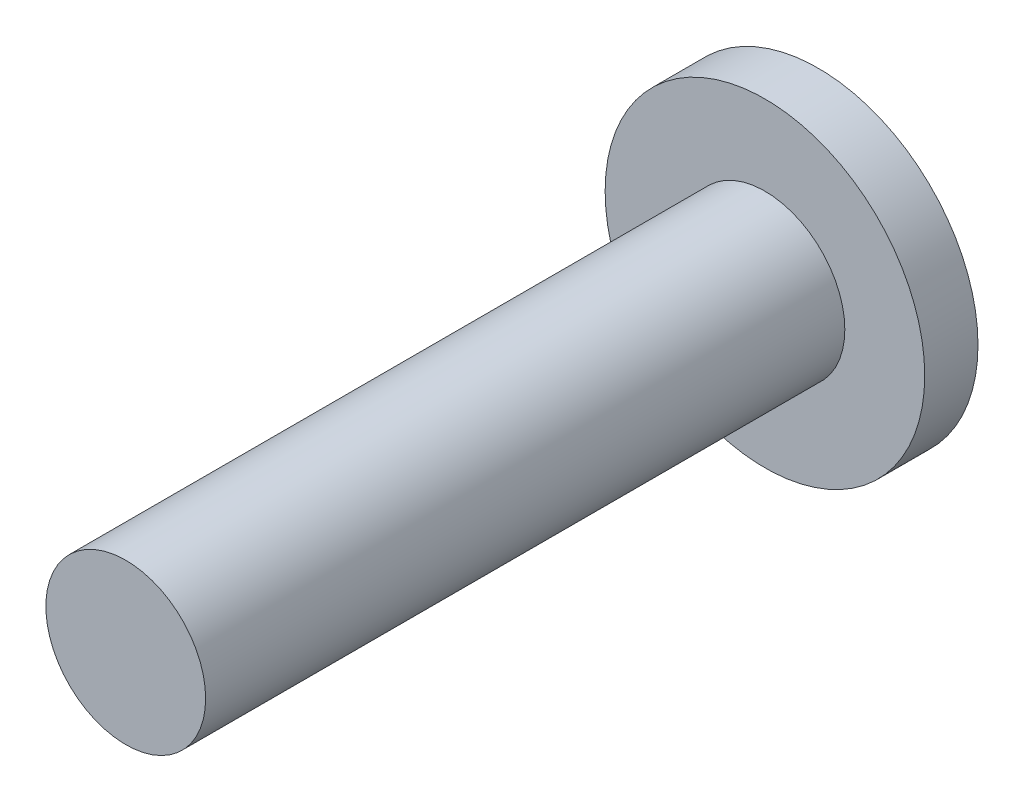
ISO-10303-21;
HEADER;
FILE_DESCRIPTION(('STEP AP214'),'2;1');
FILE_NAME('part.step','',(''),(''),'','','');
FILE_SCHEMA(('AUTOMOTIVE_DESIGN { 1 0 10303 214 1 1 1 1 }'));
ENDSEC;
DATA;
#1=APPLICATION_CONTEXT('core data for automotive mechanical design processes');
#2=APPLICATION_PROTOCOL_DEFINITION('international standard','automotive_design',2000,#1);
#3=PRODUCT_CONTEXT('',#1,'mechanical');
#4=PRODUCT('Part','Part','',(#3));
#5=PRODUCT_RELATED_PRODUCT_CATEGORY('part','',(#4));
#6=PRODUCT_DEFINITION_FORMATION('','',#4);
#7=PRODUCT_DEFINITION_CONTEXT('part definition',#1,'design');
#8=PRODUCT_DEFINITION('design','',#6,#7);
#9=PRODUCT_DEFINITION_SHAPE('','',#8);
#10=(LENGTH_UNIT() NAMED_UNIT(*) SI_UNIT(.MILLI.,.METRE.));
#11=(NAMED_UNIT(*) PLANE_ANGLE_UNIT() SI_UNIT($,.RADIAN.));
#12=(NAMED_UNIT(*) SI_UNIT($,.STERADIAN.) SOLID_ANGLE_UNIT());
#13=UNCERTAINTY_MEASURE_WITH_UNIT(LENGTH_MEASURE(1.E-05),#10,'distance_accuracy_value','');
#14=(GEOMETRIC_REPRESENTATION_CONTEXT(3) GLOBAL_UNCERTAINTY_ASSIGNED_CONTEXT((#13)) GLOBAL_UNIT_ASSIGNED_CONTEXT((#10,
#11,#12)) REPRESENTATION_CONTEXT('',''));
#15=CARTESIAN_POINT('',(0.,0.,0.));
#16=DIRECTION('',(0.,0.,1.));
#17=DIRECTION('',(1.,0.,0.));
#18=AXIS2_PLACEMENT_3D('',#15,#16,#17);
#19=CARTESIAN_POINT('',(0.,0.,1.));
#20=DIRECTION('',(0.,0.,-1.));
#21=DIRECTION('',(-1.,0.,0.));
#22=AXIS2_PLACEMENT_3D('',#19,#20,#21);
#23=CYLINDRICAL_SURFACE('',#22,3.);
#24=CARTESIAN_POINT('',(0.,0.,1.));
#25=DIRECTION('',(0.,0.,1.));
#26=DIRECTION('',(1.,0.,0.));
#27=AXIS2_PLACEMENT_3D('',#24,#25,#26);
#28=CIRCLE('',#27,3.);
#29=CARTESIAN_POINT('',(3.,0.,1.));
#30=VERTEX_POINT('',#29);
#31=EDGE_CURVE('E11',#30,#30,#28,.T.);
#32=ORIENTED_EDGE('',*,*,#31,.F.);
#33=EDGE_LOOP('',(#32));
#34=FACE_BOUND('',#33,.T.);
#35=CARTESIAN_POINT('',(0.,0.,0.));
#36=DIRECTION('',(0.,0.,1.));
#37=DIRECTION('',(1.,0.,0.));
#38=AXIS2_PLACEMENT_3D('',#35,#36,#37);
#39=CIRCLE('',#38,3.);
#40=CARTESIAN_POINT('',(3.,0.,0.));
#41=VERTEX_POINT('',#40);
#42=EDGE_CURVE('E48',#41,#41,#39,.T.);
#43=ORIENTED_EDGE('',*,*,#42,.T.);
#44=EDGE_LOOP('',(#43));
#45=FACE_BOUND('',#44,.T.);
#46=ADVANCED_FACE('F45',(#34,#45),#23,.T.);
#47=CARTESIAN_POINT('',(0.,0.,1.));
#48=DIRECTION('',(0.,0.,1.));
#49=DIRECTION('',(1.,0.,0.));
#50=AXIS2_PLACEMENT_3D('',#47,#48,#49);
#51=PLANE('',#50);
#52=CARTESIAN_POINT('',(0.,0.,1.));
#53=DIRECTION('',(0.,0.,1.));
#54=DIRECTION('',(1.,0.,0.));
#55=AXIS2_PLACEMENT_3D('',#52,#53,#54);
#56=CIRCLE('',#55,1.5);
#57=CARTESIAN_POINT('',(1.5,0.,1.));
#58=VERTEX_POINT('',#57);
#59=EDGE_CURVE('E182',#58,#58,#56,.T.);
#60=ORIENTED_EDGE('',*,*,#59,.F.);
#61=EDGE_LOOP('',(#60));
#62=FACE_BOUND('',#61,.T.);
#63=ORIENTED_EDGE('',*,*,#31,.T.);
#64=EDGE_LOOP('',(#63));
#65=FACE_BOUND('',#64,.T.);
#66=ADVANCED_FACE('F198',(#62,#65),#51,.T.);
#67=CARTESIAN_POINT('',(0.,0.,0.));
#68=DIRECTION('',(0.,0.,1.));
#69=DIRECTION('',(1.,0.,0.));
#70=AXIS2_PLACEMENT_3D('',#67,#68,#69);
#71=PLANE('',#70);
#72=DIRECTION('',(0.5,0.866025403784439,0.));
#73=VECTOR('',#72,1.);
#74=CARTESIAN_POINT('',(-1.15470053837925,0.,0.));
#75=LINE('',#74,#73);
#76=CARTESIAN_POINT('',(-1.15470053837925,0.,0.));
#77=VERTEX_POINT('',#76);
#78=CARTESIAN_POINT('',(-0.577350269189626,1.,0.));
#79=VERTEX_POINT('',#78);
#80=EDGE_CURVE('E138',#77,#79,#75,.T.);
#81=ORIENTED_EDGE('',*,*,#80,.F.);
#82=DIRECTION('',(-0.5,0.866025403784439,0.));
#83=VECTOR('',#82,1.);
#84=CARTESIAN_POINT('',(-0.577350269189626,-1.,0.));
#85=LINE('',#84,#83);
#86=CARTESIAN_POINT('',(-0.577350269189626,-1.,0.));
#87=VERTEX_POINT('',#86);
#88=EDGE_CURVE('E60',#87,#77,#85,.T.);
#89=ORIENTED_EDGE('',*,*,#88,.F.);
#90=DIRECTION('',(-1.,0.,0.));
#91=VECTOR('',#90,1.);
#92=CARTESIAN_POINT('',(0.577350269189626,-1.,0.));
#93=LINE('',#92,#91);
#94=CARTESIAN_POINT('',(0.577350269189626,-1.,0.));
#95=VERTEX_POINT('',#94);
#96=EDGE_CURVE('E152',#95,#87,#93,.T.);
#97=ORIENTED_EDGE('',*,*,#96,.F.);
#98=DIRECTION('',(-0.5,-0.866025403784439,0.));
#99=VECTOR('',#98,1.);
#100=CARTESIAN_POINT('',(1.15470053837925,0.,0.));
#101=LINE('',#100,#99);
#102=CARTESIAN_POINT('',(1.15470053837925,0.,0.));
#103=VERTEX_POINT('',#102);
#104=EDGE_CURVE('E149',#103,#95,#101,.T.);
#105=ORIENTED_EDGE('',*,*,#104,.F.);
#106=DIRECTION('',(0.5,-0.866025403784438,0.));
#107=VECTOR('',#106,1.);
#108=CARTESIAN_POINT('',(0.577350269189626,1.,0.));
#109=LINE('',#108,#107);
#110=CARTESIAN_POINT('',(0.577350269189626,1.,0.));
#111=VERTEX_POINT('',#110);
#112=EDGE_CURVE('E107',#111,#103,#109,.T.);
#113=ORIENTED_EDGE('',*,*,#112,.F.);
#114=DIRECTION('',(1.,0.,0.));
#115=VECTOR('',#114,1.);
#116=CARTESIAN_POINT('',(-0.577350269189626,1.,0.));
#117=LINE('',#116,#115);
#118=EDGE_CURVE('E143',#79,#111,#117,.T.);
#119=ORIENTED_EDGE('',*,*,#118,.F.);
#120=EDGE_LOOP('',(#81,#89,#97,#105,#113,#119));
#121=FACE_BOUND('',#120,.T.);
#122=ORIENTED_EDGE('',*,*,#42,.F.);
#123=EDGE_LOOP('',(#122));
#124=FACE_BOUND('',#123,.T.);
#125=ADVANCED_FACE('F173',(#121,#124),#71,.F.);
#126=CARTESIAN_POINT('',(-0.577350269189626,-1.,1.));
#127=DIRECTION('',(-0.866025403784439,-0.5,0.));
#128=DIRECTION('',(0.5,-0.866025403784439,0.));
#129=AXIS2_PLACEMENT_3D('',#126,#127,#128);
#130=PLANE('',#129);
#131=ORIENTED_EDGE('',*,*,#88,.T.);
#132=DIRECTION('',(0.,0.,-1.));
#133=VECTOR('',#132,1.);
#134=CARTESIAN_POINT('',(-1.15470053837925,0.,1.));
#135=LINE('',#134,#133);
#136=CARTESIAN_POINT('',(-1.15470053837925,0.,1.));
#137=VERTEX_POINT('',#136);
#138=EDGE_CURVE('E91',#137,#77,#135,.T.);
#139=ORIENTED_EDGE('',*,*,#138,.F.);
#140=DIRECTION('',(-0.5,0.866025403784439,0.));
#141=VECTOR('',#140,1.);
#142=CARTESIAN_POINT('',(-0.577350269189626,-1.,1.));
#143=LINE('',#142,#141);
#144=CARTESIAN_POINT('',(-0.577350269189626,-1.,1.));
#145=VERTEX_POINT('',#144);
#146=EDGE_CURVE('E155',#145,#137,#143,.T.);
#147=ORIENTED_EDGE('',*,*,#146,.F.);
#148=DIRECTION('',(0.,0.,-1.));
#149=VECTOR('',#148,1.);
#150=CARTESIAN_POINT('',(-0.577350269189626,-1.,1.));
#151=LINE('',#150,#149);
#152=EDGE_CURVE('E68',#145,#87,#151,.T.);
#153=ORIENTED_EDGE('',*,*,#152,.T.);
#154=EDGE_LOOP('',(#131,#139,#147,#153));
#155=FACE_BOUND('',#154,.T.);
#156=ADVANCED_FACE('F210',(#155),#130,.F.);
#157=CARTESIAN_POINT('',(0.577350269189626,-1.,1.));
#158=DIRECTION('',(0.,-1.,0.));
#159=DIRECTION('',(0.,0.,-1.));
#160=AXIS2_PLACEMENT_3D('',#157,#158,#159);
#161=PLANE('',#160);
#162=ORIENTED_EDGE('',*,*,#96,.T.);
#163=ORIENTED_EDGE('',*,*,#152,.F.);
#164=DIRECTION('',(-1.,0.,0.));
#165=VECTOR('',#164,1.);
#166=CARTESIAN_POINT('',(0.577350269189626,-1.,1.));
#167=LINE('',#166,#165);
#168=CARTESIAN_POINT('',(0.577350269189626,-1.,1.));
#169=VERTEX_POINT('',#168);
#170=EDGE_CURVE('E121',#169,#145,#167,.T.);
#171=ORIENTED_EDGE('',*,*,#170,.F.);
#172=DIRECTION('',(0.,0.,-1.));
#173=VECTOR('',#172,1.);
#174=CARTESIAN_POINT('',(0.577350269189626,-1.,1.));
#175=LINE('',#174,#173);
#176=EDGE_CURVE('E112',#169,#95,#175,.T.);
#177=ORIENTED_EDGE('',*,*,#176,.T.);
#178=EDGE_LOOP('',(#162,#163,#171,#177));
#179=FACE_BOUND('',#178,.T.);
#180=ADVANCED_FACE('F214',(#179),#161,.F.);
#181=CARTESIAN_POINT('',(1.15470053837925,0.,1.));
#182=DIRECTION('',(0.866025403784439,-0.5,0.));
#183=DIRECTION('',(0.5,0.866025403784439,0.));
#184=AXIS2_PLACEMENT_3D('',#181,#182,#183);
#185=PLANE('',#184);
#186=ORIENTED_EDGE('',*,*,#104,.T.);
#187=ORIENTED_EDGE('',*,*,#176,.F.);
#188=DIRECTION('',(-0.5,-0.866025403784439,0.));
#189=VECTOR('',#188,1.);
#190=CARTESIAN_POINT('',(1.15470053837925,0.,1.));
#191=LINE('',#190,#189);
#192=CARTESIAN_POINT('',(1.15470053837925,0.,1.));
#193=VERTEX_POINT('',#192);
#194=EDGE_CURVE('E116',#193,#169,#191,.T.);
#195=ORIENTED_EDGE('',*,*,#194,.F.);
#196=DIRECTION('',(0.,0.,-1.));
#197=VECTOR('',#196,1.);
#198=CARTESIAN_POINT('',(1.15470053837925,0.,1.));
#199=LINE('',#198,#197);
#200=EDGE_CURVE('E100',#193,#103,#199,.T.);
#201=ORIENTED_EDGE('',*,*,#200,.T.);
#202=EDGE_LOOP('',(#186,#187,#195,#201));
#203=FACE_BOUND('',#202,.T.);
#204=ADVANCED_FACE('F117',(#203),#185,.F.);
#205=CARTESIAN_POINT('',(0.577350269189626,1.,1.));
#206=DIRECTION('',(0.866025403784439,0.5,0.));
#207=DIRECTION('',(-0.5,0.866025403784438,0.));
#208=AXIS2_PLACEMENT_3D('',#205,#206,#207);
#209=PLANE('',#208);
#210=ORIENTED_EDGE('',*,*,#112,.T.);
#211=ORIENTED_EDGE('',*,*,#200,.F.);
#212=DIRECTION('',(0.5,-0.866025403784438,0.));
#213=VECTOR('',#212,1.);
#214=CARTESIAN_POINT('',(0.577350269189626,1.,1.));
#215=LINE('',#214,#213);
#216=CARTESIAN_POINT('',(0.577350269189626,1.,1.));
#217=VERTEX_POINT('',#216);
#218=EDGE_CURVE('E104',#217,#193,#215,.T.);
#219=ORIENTED_EDGE('',*,*,#218,.F.);
#220=DIRECTION('',(0.,0.,-1.));
#221=VECTOR('',#220,1.);
#222=CARTESIAN_POINT('',(0.577350269189626,1.,1.));
#223=LINE('',#222,#221);
#224=EDGE_CURVE('E113',#217,#111,#223,.T.);
#225=ORIENTED_EDGE('',*,*,#224,.T.);
#226=EDGE_LOOP('',(#210,#211,#219,#225));
#227=FACE_BOUND('',#226,.T.);
#228=ADVANCED_FACE('F102',(#227),#209,.F.);
#229=CARTESIAN_POINT('',(-0.577350269189626,1.,1.));
#230=DIRECTION('',(0.,1.,0.));
#231=DIRECTION('',(-1.,0.,0.));
#232=AXIS2_PLACEMENT_3D('',#229,#230,#231);
#233=PLANE('',#232);
#234=ORIENTED_EDGE('',*,*,#118,.T.);
#235=ORIENTED_EDGE('',*,*,#224,.F.);
#236=DIRECTION('',(1.,0.,0.));
#237=VECTOR('',#236,1.);
#238=CARTESIAN_POINT('',(-0.577350269189626,1.,1.));
#239=LINE('',#238,#237);
#240=CARTESIAN_POINT('',(-0.577350269189626,1.,1.));
#241=VERTEX_POINT('',#240);
#242=EDGE_CURVE('E126',#241,#217,#239,.T.);
#243=ORIENTED_EDGE('',*,*,#242,.F.);
#244=DIRECTION('',(0.,0.,-1.));
#245=VECTOR('',#244,1.);
#246=CARTESIAN_POINT('',(-0.577350269189626,1.,1.));
#247=LINE('',#246,#245);
#248=EDGE_CURVE('E162',#241,#79,#247,.T.);
#249=ORIENTED_EDGE('',*,*,#248,.T.);
#250=EDGE_LOOP('',(#234,#235,#243,#249));
#251=FACE_BOUND('',#250,.T.);
#252=ADVANCED_FACE('F177',(#251),#233,.F.);
#253=CARTESIAN_POINT('',(-1.15470053837925,0.,1.));
#254=DIRECTION('',(-0.866025403784439,0.5,0.));
#255=DIRECTION('',(-0.5,-0.866025403784439,0.));
#256=AXIS2_PLACEMENT_3D('',#253,#254,#255);
#257=PLANE('',#256);
#258=ORIENTED_EDGE('',*,*,#80,.T.);
#259=ORIENTED_EDGE('',*,*,#248,.F.);
#260=DIRECTION('',(0.5,0.866025403784439,0.));
#261=VECTOR('',#260,1.);
#262=CARTESIAN_POINT('',(-1.15470053837925,0.,1.));
#263=LINE('',#262,#261);
#264=EDGE_CURVE('E130',#137,#241,#263,.T.);
#265=ORIENTED_EDGE('',*,*,#264,.F.);
#266=ORIENTED_EDGE('',*,*,#138,.T.);
#267=EDGE_LOOP('',(#258,#259,#265,#266));
#268=FACE_BOUND('',#267,.T.);
#269=ADVANCED_FACE('F168',(#268),#257,.F.);
#270=CARTESIAN_POINT('',(0.,0.,1.));
#271=DIRECTION('',(0.,0.,1.));
#272=DIRECTION('',(1.,0.,0.));
#273=AXIS2_PLACEMENT_3D('',#270,#271,#272);
#274=PLANE('',#273);
#275=ORIENTED_EDGE('',*,*,#170,.T.);
#276=ORIENTED_EDGE('',*,*,#146,.T.);
#277=ORIENTED_EDGE('',*,*,#264,.T.);
#278=ORIENTED_EDGE('',*,*,#242,.T.);
#279=ORIENTED_EDGE('',*,*,#218,.T.);
#280=ORIENTED_EDGE('',*,*,#194,.T.);
#281=EDGE_LOOP('',(#275,#276,#277,#278,#279,#280));
#282=FACE_BOUND('',#281,.T.);
#283=ADVANCED_FACE('F123',(#282),#274,.F.);
#284=CARTESIAN_POINT('',(0.,0.,13.));
#285=DIRECTION('',(0.,0.,-1.));
#286=DIRECTION('',(-1.,0.,0.));
#287=AXIS2_PLACEMENT_3D('',#284,#285,#286);
#288=CYLINDRICAL_SURFACE('',#287,1.5);
#289=CARTESIAN_POINT('',(0.,0.,13.));
#290=DIRECTION('',(0.,0.,1.));
#291=DIRECTION('',(1.,0.,0.));
#292=AXIS2_PLACEMENT_3D('',#289,#290,#291);
#293=CIRCLE('',#292,1.5);
#294=CARTESIAN_POINT('',(1.5,0.,13.));
#295=VERTEX_POINT('',#294);
#296=EDGE_CURVE('E139',#295,#295,#293,.T.);
#297=ORIENTED_EDGE('',*,*,#296,.F.);
#298=EDGE_LOOP('',(#297));
#299=FACE_BOUND('',#298,.T.);
#300=ORIENTED_EDGE('',*,*,#59,.T.);
#301=EDGE_LOOP('',(#300));
#302=FACE_BOUND('',#301,.T.);
#303=ADVANCED_FACE('F192',(#299,#302),#288,.T.);
#304=CARTESIAN_POINT('',(0.,0.,13.));
#305=DIRECTION('',(0.,0.,1.));
#306=DIRECTION('',(1.,0.,0.));
#307=AXIS2_PLACEMENT_3D('',#304,#305,#306);
#308=PLANE('',#307);
#309=ORIENTED_EDGE('',*,*,#296,.T.);
#310=EDGE_LOOP('',(#309));
#311=FACE_BOUND('',#310,.T.);
#312=ADVANCED_FACE('F190',(#311),#308,.T.);
#313=CLOSED_SHELL('',(#46,#66,#125,#156,#180,#204,#228,#252,#269,#283,#303,#312));
#314=MANIFOLD_SOLID_BREP('B2',#313);
#315=ADVANCED_BREP_SHAPE_REPRESENTATION('',(#18,#314),#14);
#316=SHAPE_DEFINITION_REPRESENTATION(#9,#315);
ENDSEC;
END-ISO-10303-21;
